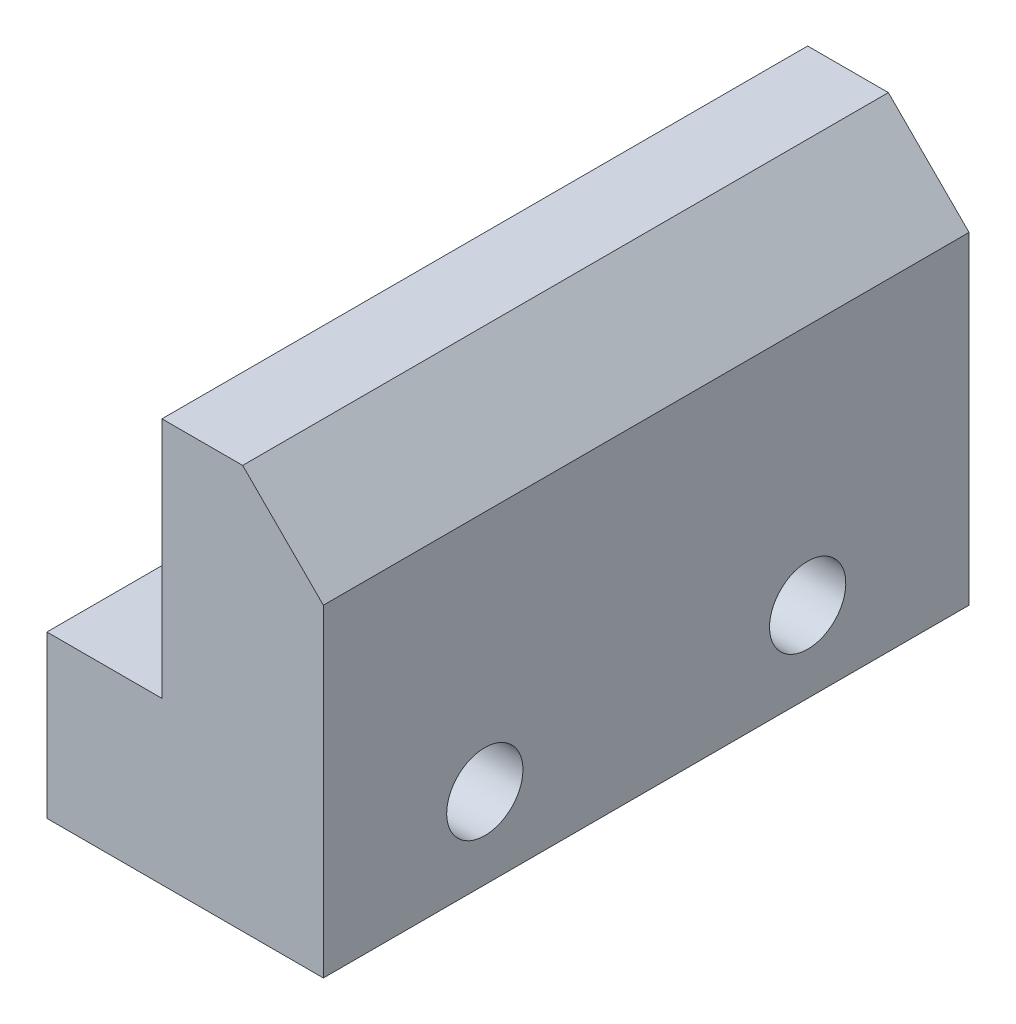
ISO-10303-21;
HEADER;
FILE_DESCRIPTION(('STEP AP214'),'2;1');
FILE_NAME('part.step','',(''),(''),'','','');
FILE_SCHEMA(('AUTOMOTIVE_DESIGN { 1 0 10303 214 1 1 1 1 }'));
ENDSEC;
DATA;
#1=APPLICATION_CONTEXT('core data for automotive mechanical design processes');
#2=APPLICATION_PROTOCOL_DEFINITION('international standard','automotive_design',2000,#1);
#3=PRODUCT_CONTEXT('',#1,'mechanical');
#4=PRODUCT('Part','Part','',(#3));
#5=PRODUCT_RELATED_PRODUCT_CATEGORY('part','',(#4));
#6=PRODUCT_DEFINITION_FORMATION('','',#4);
#7=PRODUCT_DEFINITION_CONTEXT('part definition',#1,'design');
#8=PRODUCT_DEFINITION('design','',#6,#7);
#9=PRODUCT_DEFINITION_SHAPE('','',#8);
#10=(LENGTH_UNIT() NAMED_UNIT(*) SI_UNIT(.MILLI.,.METRE.));
#11=(NAMED_UNIT(*) PLANE_ANGLE_UNIT() SI_UNIT($,.RADIAN.));
#12=(NAMED_UNIT(*) SI_UNIT($,.STERADIAN.) SOLID_ANGLE_UNIT());
#13=UNCERTAINTY_MEASURE_WITH_UNIT(LENGTH_MEASURE(1.E-05),#10,'distance_accuracy_value','');
#14=(GEOMETRIC_REPRESENTATION_CONTEXT(3) GLOBAL_UNCERTAINTY_ASSIGNED_CONTEXT((#13)) GLOBAL_UNIT_ASSIGNED_CONTEXT((#10,
#11,#12)) REPRESENTATION_CONTEXT('',''));
#15=CARTESIAN_POINT('',(0.,0.,0.));
#16=DIRECTION('',(0.,0.,1.));
#17=DIRECTION('',(1.,0.,0.));
#18=AXIS2_PLACEMENT_3D('',#15,#16,#17);
#19=CARTESIAN_POINT('',(0.,50.8,50.8));
#20=DIRECTION('',(0.,1.,0.));
#21=DIRECTION('',(0.,0.,1.));
#22=AXIS2_PLACEMENT_3D('',#19,#20,#21);
#23=PLANE('',#22);
#24=DIRECTION('',(1.,0.,0.));
#25=VECTOR('',#24,1.);
#26=CARTESIAN_POINT('',(0.,50.8,-50.8));
#27=LINE('',#26,#25);
#28=CARTESIAN_POINT('',(18.1,50.8,-50.8));
#29=VERTEX_POINT('',#28);
#30=CARTESIAN_POINT('',(30.8,50.8,-50.8));
#31=VERTEX_POINT('',#30);
#32=EDGE_CURVE('E127',#29,#31,#27,.T.);
#33=ORIENTED_EDGE('',*,*,#32,.F.);
#34=DIRECTION('',(0.,0.,-1.));
#35=VECTOR('',#34,1.);
#36=CARTESIAN_POINT('',(18.1,50.8,50.8));
#37=LINE('',#36,#35);
#38=CARTESIAN_POINT('',(18.1,50.8,50.8));
#39=VERTEX_POINT('',#38);
#40=EDGE_CURVE('E12',#39,#29,#37,.T.);
#41=ORIENTED_EDGE('',*,*,#40,.F.);
#42=DIRECTION('',(1.,0.,0.));
#43=VECTOR('',#42,1.);
#44=CARTESIAN_POINT('',(0.,50.8,50.8));
#45=LINE('',#44,#43);
#46=CARTESIAN_POINT('',(30.8,50.8,50.8));
#47=VERTEX_POINT('',#46);
#48=EDGE_CURVE('E145',#39,#47,#45,.T.);
#49=ORIENTED_EDGE('',*,*,#48,.T.);
#50=DIRECTION('',(0.,0.,-1.));
#51=VECTOR('',#50,1.);
#52=CARTESIAN_POINT('',(30.8,50.8,50.8));
#53=LINE('',#52,#51);
#54=EDGE_CURVE('E55',#47,#31,#53,.T.);
#55=ORIENTED_EDGE('',*,*,#54,.T.);
#56=EDGE_LOOP('',(#33,#41,#49,#55));
#57=FACE_BOUND('',#56,.T.);
#58=ADVANCED_FACE('F37',(#57),#23,.T.);
#59=CARTESIAN_POINT('',(18.1,0.,50.8));
#60=DIRECTION('',(1.,0.,0.));
#61=DIRECTION('',(0.,1.,0.));
#62=AXIS2_PLACEMENT_3D('',#59,#60,#61);
#63=PLANE('',#62);
#64=DIRECTION('',(0.,-1.,0.));
#65=VECTOR('',#64,1.);
#66=CARTESIAN_POINT('',(18.1,0.,-50.8));
#67=LINE('',#66,#65);
#68=CARTESIAN_POINT('',(18.1,12.7,-50.8));
#69=VERTEX_POINT('',#68);
#70=EDGE_CURVE('E129',#29,#69,#67,.T.);
#71=ORIENTED_EDGE('',*,*,#70,.T.);
#72=DIRECTION('',(0.,0.,-1.));
#73=VECTOR('',#72,1.);
#74=CARTESIAN_POINT('',(18.1,12.7,50.8));
#75=LINE('',#74,#73);
#76=CARTESIAN_POINT('',(18.1,12.7,50.8));
#77=VERTEX_POINT('',#76);
#78=EDGE_CURVE('E46',#77,#69,#75,.T.);
#79=ORIENTED_EDGE('',*,*,#78,.F.);
#80=DIRECTION('',(0.,-1.,0.));
#81=VECTOR('',#80,1.);
#82=CARTESIAN_POINT('',(18.1,0.,50.8));
#83=LINE('',#82,#81);
#84=EDGE_CURVE('E177',#39,#77,#83,.T.);
#85=ORIENTED_EDGE('',*,*,#84,.F.);
#86=ORIENTED_EDGE('',*,*,#40,.T.);
#87=EDGE_LOOP('',(#71,#79,#85,#86));
#88=FACE_BOUND('',#87,.T.);
#89=ADVANCED_FACE('F200',(#88),#63,.F.);
#90=CARTESIAN_POINT('',(0.,12.7,50.8));
#91=DIRECTION('',(0.,1.,0.));
#92=DIRECTION('',(0.,0.,1.));
#93=AXIS2_PLACEMENT_3D('',#90,#91,#92);
#94=PLANE('',#93);
#95=DIRECTION('',(1.,0.,0.));
#96=VECTOR('',#95,1.);
#97=CARTESIAN_POINT('',(0.,12.7,-50.8));
#98=LINE('',#97,#96);
#99=CARTESIAN_POINT('',(0.,12.7,-50.8));
#100=VERTEX_POINT('',#99);
#101=EDGE_CURVE('E133',#100,#69,#98,.T.);
#102=ORIENTED_EDGE('',*,*,#101,.F.);
#103=DIRECTION('',(0.,0.,-1.));
#104=VECTOR('',#103,1.);
#105=CARTESIAN_POINT('',(0.,12.7,50.8));
#106=LINE('',#105,#104);
#107=CARTESIAN_POINT('',(0.,12.7,50.8));
#108=VERTEX_POINT('',#107);
#109=EDGE_CURVE('E149',#108,#100,#106,.T.);
#110=ORIENTED_EDGE('',*,*,#109,.F.);
#111=DIRECTION('',(1.,0.,0.));
#112=VECTOR('',#111,1.);
#113=CARTESIAN_POINT('',(0.,12.7,50.8));
#114=LINE('',#113,#112);
#115=EDGE_CURVE('E179',#108,#77,#114,.T.);
#116=ORIENTED_EDGE('',*,*,#115,.T.);
#117=ORIENTED_EDGE('',*,*,#78,.T.);
#118=EDGE_LOOP('',(#102,#110,#116,#117));
#119=FACE_BOUND('',#118,.T.);
#120=ADVANCED_FACE('F204',(#119),#94,.T.);
#121=CARTESIAN_POINT('',(0.,0.,50.8));
#122=DIRECTION('',(-1.,0.,0.));
#123=DIRECTION('',(0.,0.,1.));
#124=AXIS2_PLACEMENT_3D('',#121,#122,#123);
#125=PLANE('',#124);
#126=CARTESIAN_POINT('',(0.,0.,25.4));
#127=DIRECTION('',(1.,0.,0.));
#128=DIRECTION('',(0.,1.,0.));
#129=AXIS2_PLACEMENT_3D('',#126,#127,#128);
#130=CIRCLE('',#129,3.25);
#131=CARTESIAN_POINT('',(0.,3.25,25.4));
#132=VERTEX_POINT('',#131);
#133=EDGE_CURVE('E130',#132,#132,#130,.T.);
#134=ORIENTED_EDGE('',*,*,#133,.T.);
#135=EDGE_LOOP('',(#134));
#136=FACE_BOUND('',#135,.T.);
#137=CARTESIAN_POINT('',(0.,0.,-25.4));
#138=DIRECTION('',(1.,0.,0.));
#139=DIRECTION('',(0.,1.,0.));
#140=AXIS2_PLACEMENT_3D('',#137,#138,#139);
#141=CIRCLE('',#140,3.25);
#142=CARTESIAN_POINT('',(0.,3.25,-25.4));
#143=VERTEX_POINT('',#142);
#144=EDGE_CURVE('E157',#143,#143,#141,.T.);
#145=ORIENTED_EDGE('',*,*,#144,.T.);
#146=EDGE_LOOP('',(#145));
#147=FACE_BOUND('',#146,.T.);
#148=DIRECTION('',(0.,1.,0.));
#149=VECTOR('',#148,1.);
#150=CARTESIAN_POINT('',(0.,0.,-50.8));
#151=LINE('',#150,#149);
#152=CARTESIAN_POINT('',(0.,-12.7,-50.8));
#153=VERTEX_POINT('',#152);
#154=EDGE_CURVE('E136',#153,#100,#151,.T.);
#155=ORIENTED_EDGE('',*,*,#154,.F.);
#156=DIRECTION('',(0.,0.,-1.));
#157=VECTOR('',#156,1.);
#158=CARTESIAN_POINT('',(0.,-12.7,50.8));
#159=LINE('',#158,#157);
#160=CARTESIAN_POINT('',(0.,-12.7,50.8));
#161=VERTEX_POINT('',#160);
#162=EDGE_CURVE('E119',#161,#153,#159,.T.);
#163=ORIENTED_EDGE('',*,*,#162,.F.);
#164=DIRECTION('',(0.,1.,0.));
#165=VECTOR('',#164,1.);
#166=CARTESIAN_POINT('',(0.,0.,50.8));
#167=LINE('',#166,#165);
#168=EDGE_CURVE('E109',#161,#108,#167,.T.);
#169=ORIENTED_EDGE('',*,*,#168,.T.);
#170=ORIENTED_EDGE('',*,*,#109,.T.);
#171=EDGE_LOOP('',(#155,#163,#169,#170));
#172=FACE_BOUND('',#171,.T.);
#173=ADVANCED_FACE('F183',(#136,#147,#172),#125,.T.);
#174=CARTESIAN_POINT('',(0.,-12.7,50.8));
#175=DIRECTION('',(0.,1.,0.));
#176=DIRECTION('',(0.,0.,1.));
#177=AXIS2_PLACEMENT_3D('',#174,#175,#176);
#178=PLANE('',#177);
#179=DIRECTION('',(1.,0.,0.));
#180=VECTOR('',#179,1.);
#181=CARTESIAN_POINT('',(0.,-12.7,-50.8));
#182=LINE('',#181,#180);
#183=CARTESIAN_POINT('',(43.5,-12.7,-50.8));
#184=VERTEX_POINT('',#183);
#185=EDGE_CURVE('E116',#153,#184,#182,.T.);
#186=ORIENTED_EDGE('',*,*,#185,.T.);
#187=DIRECTION('',(0.,0.,-1.));
#188=VECTOR('',#187,1.);
#189=CARTESIAN_POINT('',(43.5,-12.7,50.8));
#190=LINE('',#189,#188);
#191=CARTESIAN_POINT('',(43.5,-12.7,50.8));
#192=VERTEX_POINT('',#191);
#193=EDGE_CURVE('E113',#192,#184,#190,.T.);
#194=ORIENTED_EDGE('',*,*,#193,.F.);
#195=DIRECTION('',(1.,0.,0.));
#196=VECTOR('',#195,1.);
#197=CARTESIAN_POINT('',(0.,-12.7,50.8));
#198=LINE('',#197,#196);
#199=EDGE_CURVE('E100',#161,#192,#198,.T.);
#200=ORIENTED_EDGE('',*,*,#199,.F.);
#201=ORIENTED_EDGE('',*,*,#162,.T.);
#202=EDGE_LOOP('',(#186,#194,#200,#201));
#203=FACE_BOUND('',#202,.T.);
#204=ADVANCED_FACE('F114',(#203),#178,.F.);
#205=CARTESIAN_POINT('',(43.5,0.,50.8));
#206=DIRECTION('',(1.,0.,0.));
#207=DIRECTION('',(0.,1.,0.));
#208=AXIS2_PLACEMENT_3D('',#205,#206,#207);
#209=PLANE('',#208);
#210=CARTESIAN_POINT('',(43.5,0.,25.4));
#211=DIRECTION('',(1.,0.,0.));
#212=DIRECTION('',(0.,1.,0.));
#213=AXIS2_PLACEMENT_3D('',#210,#211,#212);
#214=CIRCLE('',#213,6.);
#215=CARTESIAN_POINT('',(43.5,6.,25.4));
#216=VERTEX_POINT('',#215);
#217=EDGE_CURVE('E159',#216,#216,#214,.T.);
#218=ORIENTED_EDGE('',*,*,#217,.F.);
#219=EDGE_LOOP('',(#218));
#220=FACE_BOUND('',#219,.T.);
#221=CARTESIAN_POINT('',(43.5,0.,-25.4));
#222=DIRECTION('',(1.,0.,0.));
#223=DIRECTION('',(0.,1.,0.));
#224=AXIS2_PLACEMENT_3D('',#221,#222,#223);
#225=CIRCLE('',#224,6.);
#226=CARTESIAN_POINT('',(43.5,6.,-25.4));
#227=VERTEX_POINT('',#226);
#228=EDGE_CURVE('E167',#227,#227,#225,.T.);
#229=ORIENTED_EDGE('',*,*,#228,.F.);
#230=EDGE_LOOP('',(#229));
#231=FACE_BOUND('',#230,.T.);
#232=DIRECTION('',(0.,-1.,0.));
#233=VECTOR('',#232,1.);
#234=CARTESIAN_POINT('',(43.5,0.,-50.8));
#235=LINE('',#234,#233);
#236=CARTESIAN_POINT('',(43.5,38.1,-50.8));
#237=VERTEX_POINT('',#236);
#238=EDGE_CURVE('E140',#237,#184,#235,.T.);
#239=ORIENTED_EDGE('',*,*,#238,.F.);
#240=DIRECTION('',(0.,0.,-1.));
#241=VECTOR('',#240,1.);
#242=CARTESIAN_POINT('',(43.5,38.1,50.8));
#243=LINE('',#242,#241);
#244=CARTESIAN_POINT('',(43.5,38.1,50.8));
#245=VERTEX_POINT('',#244);
#246=EDGE_CURVE('E77',#245,#237,#243,.T.);
#247=ORIENTED_EDGE('',*,*,#246,.F.);
#248=DIRECTION('',(0.,-1.,0.));
#249=VECTOR('',#248,1.);
#250=CARTESIAN_POINT('',(43.5,0.,50.8));
#251=LINE('',#250,#249);
#252=EDGE_CURVE('E106',#245,#192,#251,.T.);
#253=ORIENTED_EDGE('',*,*,#252,.T.);
#254=ORIENTED_EDGE('',*,*,#193,.T.);
#255=EDGE_LOOP('',(#239,#247,#253,#254));
#256=FACE_BOUND('',#255,.T.);
#257=ADVANCED_FACE('F121',(#220,#231,#256),#209,.T.);
#258=CARTESIAN_POINT('',(40.8,40.8,50.8));
#259=DIRECTION('',(0.707106781186548,0.707106781186548,0.));
#260=DIRECTION('',(-0.707106781186548,0.707106781186548,0.));
#261=AXIS2_PLACEMENT_3D('',#258,#259,#260);
#262=PLANE('',#261);
#263=DIRECTION('',(0.707106781186548,-0.707106781186548,0.));
#264=VECTOR('',#263,1.);
#265=CARTESIAN_POINT('',(40.8,40.8,-50.8));
#266=LINE('',#265,#264);
#267=EDGE_CURVE('E142',#31,#237,#266,.T.);
#268=ORIENTED_EDGE('',*,*,#267,.F.);
#269=ORIENTED_EDGE('',*,*,#54,.F.);
#270=DIRECTION('',(0.707106781186548,-0.707106781186548,0.));
#271=VECTOR('',#270,1.);
#272=CARTESIAN_POINT('',(40.8,40.8,50.8));
#273=LINE('',#272,#271);
#274=EDGE_CURVE('E122',#47,#245,#273,.T.);
#275=ORIENTED_EDGE('',*,*,#274,.T.);
#276=ORIENTED_EDGE('',*,*,#246,.T.);
#277=EDGE_LOOP('',(#268,#269,#275,#276));
#278=FACE_BOUND('',#277,.T.);
#279=ADVANCED_FACE('F188',(#278),#262,.T.);
#280=CARTESIAN_POINT('',(0.,0.,50.8));
#281=DIRECTION('',(0.,0.,1.));
#282=DIRECTION('',(1.,0.,0.));
#283=AXIS2_PLACEMENT_3D('',#280,#281,#282);
#284=PLANE('',#283);
#285=ORIENTED_EDGE('',*,*,#48,.F.);
#286=ORIENTED_EDGE('',*,*,#84,.T.);
#287=ORIENTED_EDGE('',*,*,#115,.F.);
#288=ORIENTED_EDGE('',*,*,#168,.F.);
#289=ORIENTED_EDGE('',*,*,#199,.T.);
#290=ORIENTED_EDGE('',*,*,#252,.F.);
#291=ORIENTED_EDGE('',*,*,#274,.F.);
#292=EDGE_LOOP('',(#285,#286,#287,#288,#289,#290,#291));
#293=FACE_BOUND('',#292,.T.);
#294=ADVANCED_FACE('F103',(#293),#284,.T.);
#295=CARTESIAN_POINT('',(0.,0.,-50.8));
#296=DIRECTION('',(0.,0.,1.));
#297=DIRECTION('',(1.,0.,0.));
#298=AXIS2_PLACEMENT_3D('',#295,#296,#297);
#299=PLANE('',#298);
#300=ORIENTED_EDGE('',*,*,#32,.T.);
#301=ORIENTED_EDGE('',*,*,#267,.T.);
#302=ORIENTED_EDGE('',*,*,#238,.T.);
#303=ORIENTED_EDGE('',*,*,#185,.F.);
#304=ORIENTED_EDGE('',*,*,#154,.T.);
#305=ORIENTED_EDGE('',*,*,#101,.T.);
#306=ORIENTED_EDGE('',*,*,#70,.F.);
#307=EDGE_LOOP('',(#300,#301,#302,#303,#304,#305,#306));
#308=FACE_BOUND('',#307,.T.);
#309=ADVANCED_FACE('F186',(#308),#299,.F.);
#310=CARTESIAN_POINT('',(0.,0.,-25.4));
#311=DIRECTION('',(1.,0.,0.));
#312=DIRECTION('',(0.,1.,0.));
#313=AXIS2_PLACEMENT_3D('',#310,#311,#312);
#314=CYLINDRICAL_SURFACE('',#313,3.25);
#315=CARTESIAN_POINT('',(10.,0.,-25.4));
#316=DIRECTION('',(-1.,0.,0.));
#317=DIRECTION('',(0.,0.,1.));
#318=AXIS2_PLACEMENT_3D('',#315,#316,#317);
#319=CIRCLE('',#318,3.25);
#320=CARTESIAN_POINT('',(10.,0.,-22.15));
#321=VERTEX_POINT('',#320);
#322=EDGE_CURVE('E40',#321,#321,#319,.F.);
#323=ORIENTED_EDGE('',*,*,#322,.T.);
#324=EDGE_LOOP('',(#323));
#325=FACE_BOUND('',#324,.T.);
#326=ORIENTED_EDGE('',*,*,#144,.F.);
#327=EDGE_LOOP('',(#326));
#328=FACE_BOUND('',#327,.T.);
#329=ADVANCED_FACE('F234',(#325,#328),#314,.F.);
#330=CARTESIAN_POINT('',(0.,0.,25.4));
#331=DIRECTION('',(1.,0.,0.));
#332=DIRECTION('',(0.,1.,0.));
#333=AXIS2_PLACEMENT_3D('',#330,#331,#332);
#334=CYLINDRICAL_SURFACE('',#333,3.25);
#335=CARTESIAN_POINT('',(10.,0.,25.4));
#336=DIRECTION('',(-1.,0.,0.));
#337=DIRECTION('',(0.,0.,1.));
#338=AXIS2_PLACEMENT_3D('',#335,#336,#337);
#339=CIRCLE('',#338,3.25);
#340=CARTESIAN_POINT('',(10.,0.,28.65));
#341=VERTEX_POINT('',#340);
#342=EDGE_CURVE('E151',#341,#341,#339,.F.);
#343=ORIENTED_EDGE('',*,*,#342,.T.);
#344=EDGE_LOOP('',(#343));
#345=FACE_BOUND('',#344,.T.);
#346=ORIENTED_EDGE('',*,*,#133,.F.);
#347=EDGE_LOOP('',(#346));
#348=FACE_BOUND('',#347,.T.);
#349=ADVANCED_FACE('F239',(#345,#348),#334,.F.);
#350=CARTESIAN_POINT('',(10.,0.,50.8));
#351=DIRECTION('',(-1.,0.,0.));
#352=DIRECTION('',(0.,0.,1.));
#353=AXIS2_PLACEMENT_3D('',#350,#351,#352);
#354=PLANE('',#353);
#355=CARTESIAN_POINT('',(10.,0.,25.4));
#356=DIRECTION('',(-1.,0.,0.));
#357=DIRECTION('',(0.,0.,1.));
#358=AXIS2_PLACEMENT_3D('',#355,#356,#357);
#359=CIRCLE('',#358,6.);
#360=CARTESIAN_POINT('',(10.,0.,31.4));
#361=VERTEX_POINT('',#360);
#362=EDGE_CURVE('E153',#361,#361,#359,.F.);
#363=ORIENTED_EDGE('',*,*,#362,.T.);
#364=EDGE_LOOP('',(#363));
#365=FACE_BOUND('',#364,.T.);
#366=ORIENTED_EDGE('',*,*,#342,.F.);
#367=EDGE_LOOP('',(#366));
#368=FACE_BOUND('',#367,.T.);
#369=ADVANCED_FACE('F251',(#365,#368),#354,.F.);
#370=CARTESIAN_POINT('',(-16.9705627484771,0.,25.4));
#371=DIRECTION('',(1.,0.,0.));
#372=DIRECTION('',(0.,1.,0.));
#373=AXIS2_PLACEMENT_3D('',#370,#371,#372);
#374=CYLINDRICAL_SURFACE('',#373,6.);
#375=ORIENTED_EDGE('',*,*,#217,.T.);
#376=EDGE_LOOP('',(#375));
#377=FACE_BOUND('',#376,.T.);
#378=ORIENTED_EDGE('',*,*,#362,.F.);
#379=EDGE_LOOP('',(#378));
#380=FACE_BOUND('',#379,.T.);
#381=ADVANCED_FACE('F260',(#377,#380),#374,.F.);
#382=CARTESIAN_POINT('',(10.,0.,50.8));
#383=DIRECTION('',(-1.,0.,0.));
#384=DIRECTION('',(0.,0.,1.));
#385=AXIS2_PLACEMENT_3D('',#382,#383,#384);
#386=PLANE('',#385);
#387=CARTESIAN_POINT('',(10.,0.,-25.4));
#388=DIRECTION('',(-1.,0.,0.));
#389=DIRECTION('',(0.,0.,1.));
#390=AXIS2_PLACEMENT_3D('',#387,#388,#389);
#391=CIRCLE('',#390,6.);
#392=CARTESIAN_POINT('',(10.,0.,-19.4));
#393=VERTEX_POINT('',#392);
#394=EDGE_CURVE('E164',#393,#393,#391,.F.);
#395=ORIENTED_EDGE('',*,*,#394,.T.);
#396=EDGE_LOOP('',(#395));
#397=FACE_BOUND('',#396,.T.);
#398=ORIENTED_EDGE('',*,*,#322,.F.);
#399=EDGE_LOOP('',(#398));
#400=FACE_BOUND('',#399,.T.);
#401=ADVANCED_FACE('F269',(#397,#400),#386,.F.);
#402=CARTESIAN_POINT('',(-16.9705627484771,0.,-25.4));
#403=DIRECTION('',(1.,0.,0.));
#404=DIRECTION('',(0.,1.,0.));
#405=AXIS2_PLACEMENT_3D('',#402,#403,#404);
#406=CYLINDRICAL_SURFACE('',#405,6.);
#407=ORIENTED_EDGE('',*,*,#228,.T.);
#408=EDGE_LOOP('',(#407));
#409=FACE_BOUND('',#408,.T.);
#410=ORIENTED_EDGE('',*,*,#394,.F.);
#411=EDGE_LOOP('',(#410));
#412=FACE_BOUND('',#411,.T.);
#413=ADVANCED_FACE('F279',(#409,#412),#406,.F.);
#414=CLOSED_SHELL('',(#58,#89,#120,#173,#204,#257,#279,#294,#309,#329,#349,#369,#381,#401,#413));
#415=MANIFOLD_SOLID_BREP('B2',#414);
#416=ADVANCED_BREP_SHAPE_REPRESENTATION('',(#18,#415),#14);
#417=SHAPE_DEFINITION_REPRESENTATION(#9,#416);
ENDSEC;
END-ISO-10303-21;
